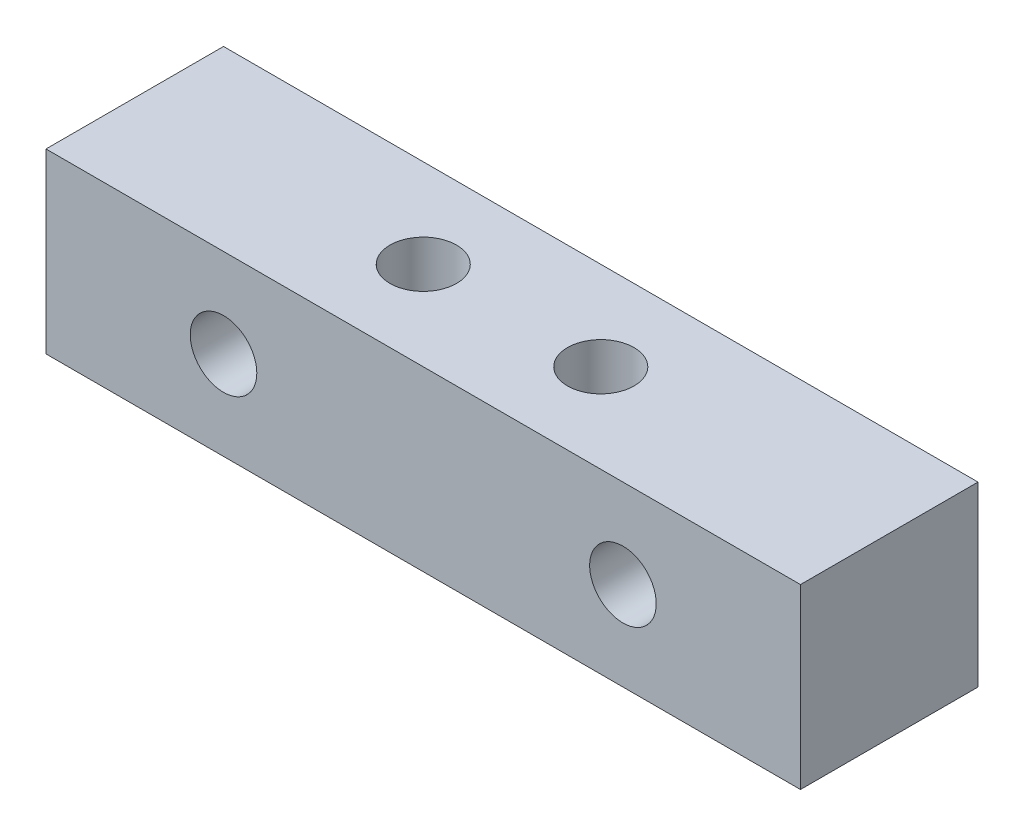
ISO-10303-21;
HEADER;
FILE_DESCRIPTION(('STEP AP214'),'2;1');
FILE_NAME('part.step','',(''),(''),'','','');
FILE_SCHEMA(('AUTOMOTIVE_DESIGN { 1 0 10303 214 1 1 1 1 }'));
ENDSEC;
DATA;
#1=APPLICATION_CONTEXT('core data for automotive mechanical design processes');
#2=APPLICATION_PROTOCOL_DEFINITION('international standard','automotive_design',2000,#1);
#3=PRODUCT_CONTEXT('',#1,'mechanical');
#4=PRODUCT('Part','Part','',(#3));
#5=PRODUCT_RELATED_PRODUCT_CATEGORY('part','',(#4));
#6=PRODUCT_DEFINITION_FORMATION('','',#4);
#7=PRODUCT_DEFINITION_CONTEXT('part definition',#1,'design');
#8=PRODUCT_DEFINITION('design','',#6,#7);
#9=PRODUCT_DEFINITION_SHAPE('','',#8);
#10=(LENGTH_UNIT() NAMED_UNIT(*) SI_UNIT(.MILLI.,.METRE.));
#11=(NAMED_UNIT(*) PLANE_ANGLE_UNIT() SI_UNIT($,.RADIAN.));
#12=(NAMED_UNIT(*) SI_UNIT($,.STERADIAN.) SOLID_ANGLE_UNIT());
#13=UNCERTAINTY_MEASURE_WITH_UNIT(LENGTH_MEASURE(1.E-05),#10,'distance_accuracy_value','');
#14=(GEOMETRIC_REPRESENTATION_CONTEXT(3) GLOBAL_UNCERTAINTY_ASSIGNED_CONTEXT((#13)) GLOBAL_UNIT_ASSIGNED_CONTEXT((#10,
#11,#12)) REPRESENTATION_CONTEXT('',''));
#15=CARTESIAN_POINT('',(0.,0.,0.));
#16=DIRECTION('',(0.,0.,1.));
#17=DIRECTION('',(1.,0.,0.));
#18=AXIS2_PLACEMENT_3D('',#15,#16,#17);
#19=CARTESIAN_POINT('',(0.,0.,8.));
#20=DIRECTION('',(1.,0.,0.));
#21=DIRECTION('',(0.,0.,-1.));
#22=AXIS2_PLACEMENT_3D('',#19,#20,#21);
#23=PLANE('',#22);
#24=DIRECTION('',(0.,-1.,0.));
#25=VECTOR('',#24,1.);
#26=CARTESIAN_POINT('',(0.,0.,0.));
#27=LINE('',#26,#25);
#28=CARTESIAN_POINT('',(0.,8.,0.));
#29=VERTEX_POINT('',#28);
#30=CARTESIAN_POINT('',(0.,0.,0.));
#31=VERTEX_POINT('',#30);
#32=EDGE_CURVE('E98',#29,#31,#27,.T.);
#33=ORIENTED_EDGE('',*,*,#32,.T.);
#34=DIRECTION('',(0.,0.,-1.));
#35=VECTOR('',#34,1.);
#36=CARTESIAN_POINT('',(0.,0.,8.));
#37=LINE('',#36,#35);
#38=CARTESIAN_POINT('',(0.,0.,8.));
#39=VERTEX_POINT('',#38);
#40=EDGE_CURVE('E11',#39,#31,#37,.T.);
#41=ORIENTED_EDGE('',*,*,#40,.F.);
#42=DIRECTION('',(0.,-1.,0.));
#43=VECTOR('',#42,1.);
#44=CARTESIAN_POINT('',(0.,0.,8.));
#45=LINE('',#44,#43);
#46=CARTESIAN_POINT('',(0.,8.,8.));
#47=VERTEX_POINT('',#46);
#48=EDGE_CURVE('E86',#47,#39,#45,.T.);
#49=ORIENTED_EDGE('',*,*,#48,.F.);
#50=DIRECTION('',(0.,0.,-1.));
#51=VECTOR('',#50,1.);
#52=CARTESIAN_POINT('',(0.,8.,8.));
#53=LINE('',#52,#51);
#54=EDGE_CURVE('E94',#47,#29,#53,.T.);
#55=ORIENTED_EDGE('',*,*,#54,.T.);
#56=EDGE_LOOP('',(#33,#41,#49,#55));
#57=FACE_BOUND('',#56,.T.);
#58=ADVANCED_FACE('F35',(#57),#23,.F.);
#59=CARTESIAN_POINT('',(0.,0.,8.));
#60=DIRECTION('',(0.,1.,0.));
#61=DIRECTION('',(0.,0.,1.));
#62=AXIS2_PLACEMENT_3D('',#59,#60,#61);
#63=PLANE('',#62);
#64=CARTESIAN_POINT('',(13.,0.,4.));
#65=DIRECTION('',(0.,1.,0.));
#66=DIRECTION('',(0.,0.,1.));
#67=AXIS2_PLACEMENT_3D('',#64,#65,#66);
#68=CIRCLE('',#67,1.5);
#69=CARTESIAN_POINT('',(13.,0.,5.5));
#70=VERTEX_POINT('',#69);
#71=EDGE_CURVE('E116',#70,#70,#68,.T.);
#72=ORIENTED_EDGE('',*,*,#71,.T.);
#73=EDGE_LOOP('',(#72));
#74=FACE_BOUND('',#73,.T.);
#75=CARTESIAN_POINT('',(21.,0.,4.));
#76=DIRECTION('',(0.,1.,0.));
#77=DIRECTION('',(0.,0.,1.));
#78=AXIS2_PLACEMENT_3D('',#75,#76,#77);
#79=CIRCLE('',#78,1.5);
#80=CARTESIAN_POINT('',(21.,0.,5.5));
#81=VERTEX_POINT('',#80);
#82=EDGE_CURVE('E127',#81,#81,#79,.T.);
#83=ORIENTED_EDGE('',*,*,#82,.T.);
#84=EDGE_LOOP('',(#83));
#85=FACE_BOUND('',#84,.T.);
#86=DIRECTION('',(1.,0.,0.));
#87=VECTOR('',#86,1.);
#88=CARTESIAN_POINT('',(0.,0.,0.));
#89=LINE('',#88,#87);
#90=CARTESIAN_POINT('',(34.,0.,0.));
#91=VERTEX_POINT('',#90);
#92=EDGE_CURVE('E90',#31,#91,#89,.T.);
#93=ORIENTED_EDGE('',*,*,#92,.T.);
#94=DIRECTION('',(0.,0.,-1.));
#95=VECTOR('',#94,1.);
#96=CARTESIAN_POINT('',(34.,0.,8.));
#97=LINE('',#96,#95);
#98=CARTESIAN_POINT('',(34.,0.,8.));
#99=VERTEX_POINT('',#98);
#100=EDGE_CURVE('E43',#99,#91,#97,.T.);
#101=ORIENTED_EDGE('',*,*,#100,.F.);
#102=DIRECTION('',(1.,0.,0.));
#103=VECTOR('',#102,1.);
#104=CARTESIAN_POINT('',(0.,0.,8.));
#105=LINE('',#104,#103);
#106=EDGE_CURVE('E81',#39,#99,#105,.T.);
#107=ORIENTED_EDGE('',*,*,#106,.F.);
#108=ORIENTED_EDGE('',*,*,#40,.T.);
#109=EDGE_LOOP('',(#93,#101,#107,#108));
#110=FACE_BOUND('',#109,.T.);
#111=ADVANCED_FACE('F89',(#74,#85,#110),#63,.F.);
#112=CARTESIAN_POINT('',(34.,0.,8.));
#113=DIRECTION('',(-1.,0.,0.));
#114=DIRECTION('',(0.,0.,1.));
#115=AXIS2_PLACEMENT_3D('',#112,#113,#114);
#116=PLANE('',#115);
#117=DIRECTION('',(0.,1.,0.));
#118=VECTOR('',#117,1.);
#119=CARTESIAN_POINT('',(34.,0.,0.));
#120=LINE('',#119,#118);
#121=CARTESIAN_POINT('',(34.,8.,0.));
#122=VERTEX_POINT('',#121);
#123=EDGE_CURVE('E68',#91,#122,#120,.T.);
#124=ORIENTED_EDGE('',*,*,#123,.T.);
#125=DIRECTION('',(0.,0.,-1.));
#126=VECTOR('',#125,1.);
#127=CARTESIAN_POINT('',(34.,8.,8.));
#128=LINE('',#127,#126);
#129=CARTESIAN_POINT('',(34.,8.,8.));
#130=VERTEX_POINT('',#129);
#131=EDGE_CURVE('E91',#130,#122,#128,.T.);
#132=ORIENTED_EDGE('',*,*,#131,.F.);
#133=DIRECTION('',(0.,1.,0.));
#134=VECTOR('',#133,1.);
#135=CARTESIAN_POINT('',(34.,0.,8.));
#136=LINE('',#135,#134);
#137=EDGE_CURVE('E84',#99,#130,#136,.T.);
#138=ORIENTED_EDGE('',*,*,#137,.F.);
#139=ORIENTED_EDGE('',*,*,#100,.T.);
#140=EDGE_LOOP('',(#124,#132,#138,#139));
#141=FACE_BOUND('',#140,.T.);
#142=ADVANCED_FACE('F92',(#141),#116,.F.);
#143=CARTESIAN_POINT('',(0.,8.,8.));
#144=DIRECTION('',(0.,-1.,0.));
#145=DIRECTION('',(0.,0.,-1.));
#146=AXIS2_PLACEMENT_3D('',#143,#144,#145);
#147=PLANE('',#146);
#148=CARTESIAN_POINT('',(13.,8.,4.));
#149=DIRECTION('',(0.,1.,0.));
#150=DIRECTION('',(0.,0.,1.));
#151=AXIS2_PLACEMENT_3D('',#148,#149,#150);
#152=CIRCLE('',#151,1.5);
#153=CARTESIAN_POINT('',(13.,8.,5.5));
#154=VERTEX_POINT('',#153);
#155=EDGE_CURVE('E130',#154,#154,#152,.T.);
#156=ORIENTED_EDGE('',*,*,#155,.F.);
#157=EDGE_LOOP('',(#156));
#158=FACE_BOUND('',#157,.T.);
#159=CARTESIAN_POINT('',(21.,8.,4.));
#160=DIRECTION('',(0.,1.,0.));
#161=DIRECTION('',(0.,0.,1.));
#162=AXIS2_PLACEMENT_3D('',#159,#160,#161);
#163=CIRCLE('',#162,1.5);
#164=CARTESIAN_POINT('',(21.,8.,5.5));
#165=VERTEX_POINT('',#164);
#166=EDGE_CURVE('E124',#165,#165,#163,.T.);
#167=ORIENTED_EDGE('',*,*,#166,.F.);
#168=EDGE_LOOP('',(#167));
#169=FACE_BOUND('',#168,.T.);
#170=DIRECTION('',(-1.,0.,0.));
#171=VECTOR('',#170,1.);
#172=CARTESIAN_POINT('',(0.,8.,0.));
#173=LINE('',#172,#171);
#174=EDGE_CURVE('E74',#122,#29,#173,.T.);
#175=ORIENTED_EDGE('',*,*,#174,.T.);
#176=ORIENTED_EDGE('',*,*,#54,.F.);
#177=DIRECTION('',(-1.,0.,0.));
#178=VECTOR('',#177,1.);
#179=CARTESIAN_POINT('',(0.,8.,8.));
#180=LINE('',#179,#178);
#181=EDGE_CURVE('E51',#130,#47,#180,.T.);
#182=ORIENTED_EDGE('',*,*,#181,.F.);
#183=ORIENTED_EDGE('',*,*,#131,.T.);
#184=EDGE_LOOP('',(#175,#176,#182,#183));
#185=FACE_BOUND('',#184,.T.);
#186=ADVANCED_FACE('F106',(#158,#169,#185),#147,.F.);
#187=CARTESIAN_POINT('',(0.,0.,8.));
#188=DIRECTION('',(0.,0.,-1.));
#189=DIRECTION('',(-1.,0.,0.));
#190=AXIS2_PLACEMENT_3D('',#187,#188,#189);
#191=PLANE('',#190);
#192=CARTESIAN_POINT('',(8.,4.,8.));
#193=DIRECTION('',(0.,0.,1.));
#194=DIRECTION('',(1.,0.,0.));
#195=AXIS2_PLACEMENT_3D('',#192,#193,#194);
#196=CIRCLE('',#195,1.5);
#197=CARTESIAN_POINT('',(9.5,4.,8.));
#198=VERTEX_POINT('',#197);
#199=EDGE_CURVE('E119',#198,#198,#196,.T.);
#200=ORIENTED_EDGE('',*,*,#199,.F.);
#201=EDGE_LOOP('',(#200));
#202=FACE_BOUND('',#201,.T.);
#203=CARTESIAN_POINT('',(26.,4.,8.));
#204=DIRECTION('',(0.,0.,1.));
#205=DIRECTION('',(1.,0.,0.));
#206=AXIS2_PLACEMENT_3D('',#203,#204,#205);
#207=CIRCLE('',#206,1.5);
#208=CARTESIAN_POINT('',(27.5,4.,8.));
#209=VERTEX_POINT('',#208);
#210=EDGE_CURVE('E112',#209,#209,#207,.T.);
#211=ORIENTED_EDGE('',*,*,#210,.F.);
#212=EDGE_LOOP('',(#211));
#213=FACE_BOUND('',#212,.T.);
#214=ORIENTED_EDGE('',*,*,#48,.T.);
#215=ORIENTED_EDGE('',*,*,#106,.T.);
#216=ORIENTED_EDGE('',*,*,#137,.T.);
#217=ORIENTED_EDGE('',*,*,#181,.T.);
#218=EDGE_LOOP('',(#214,#215,#216,#217));
#219=FACE_BOUND('',#218,.T.);
#220=ADVANCED_FACE('F82',(#202,#213,#219),#191,.F.);
#221=CARTESIAN_POINT('',(0.,0.,0.));
#222=DIRECTION('',(0.,0.,-1.));
#223=DIRECTION('',(-1.,0.,0.));
#224=AXIS2_PLACEMENT_3D('',#221,#222,#223);
#225=PLANE('',#224);
#226=CARTESIAN_POINT('',(8.,4.,0.));
#227=DIRECTION('',(0.,0.,1.));
#228=DIRECTION('',(1.,0.,0.));
#229=AXIS2_PLACEMENT_3D('',#226,#227,#228);
#230=CIRCLE('',#229,1.5);
#231=CARTESIAN_POINT('',(9.5,4.,0.));
#232=VERTEX_POINT('',#231);
#233=EDGE_CURVE('E101',#232,#232,#230,.T.);
#234=ORIENTED_EDGE('',*,*,#233,.T.);
#235=EDGE_LOOP('',(#234));
#236=FACE_BOUND('',#235,.T.);
#237=CARTESIAN_POINT('',(26.,4.,0.));
#238=DIRECTION('',(0.,0.,1.));
#239=DIRECTION('',(1.,0.,0.));
#240=AXIS2_PLACEMENT_3D('',#237,#238,#239);
#241=CIRCLE('',#240,1.5);
#242=CARTESIAN_POINT('',(27.5,4.,0.));
#243=VERTEX_POINT('',#242);
#244=EDGE_CURVE('E115',#243,#243,#241,.T.);
#245=ORIENTED_EDGE('',*,*,#244,.T.);
#246=EDGE_LOOP('',(#245));
#247=FACE_BOUND('',#246,.T.);
#248=ORIENTED_EDGE('',*,*,#32,.F.);
#249=ORIENTED_EDGE('',*,*,#174,.F.);
#250=ORIENTED_EDGE('',*,*,#123,.F.);
#251=ORIENTED_EDGE('',*,*,#92,.F.);
#252=EDGE_LOOP('',(#248,#249,#250,#251));
#253=FACE_BOUND('',#252,.T.);
#254=ADVANCED_FACE('F109',(#236,#247,#253),#225,.T.);
#255=CARTESIAN_POINT('',(26.,4.,0.));
#256=DIRECTION('',(0.,0.,1.));
#257=DIRECTION('',(1.,0.,0.));
#258=AXIS2_PLACEMENT_3D('',#255,#256,#257);
#259=CYLINDRICAL_SURFACE('',#258,1.5);
#260=ORIENTED_EDGE('',*,*,#244,.F.);
#261=EDGE_LOOP('',(#260));
#262=FACE_BOUND('',#261,.T.);
#263=ORIENTED_EDGE('',*,*,#210,.T.);
#264=EDGE_LOOP('',(#263));
#265=FACE_BOUND('',#264,.T.);
#266=ADVANCED_FACE('F157',(#262,#265),#259,.F.);
#267=CARTESIAN_POINT('',(8.,4.,0.));
#268=DIRECTION('',(0.,0.,1.));
#269=DIRECTION('',(1.,0.,0.));
#270=AXIS2_PLACEMENT_3D('',#267,#268,#269);
#271=CYLINDRICAL_SURFACE('',#270,1.5);
#272=ORIENTED_EDGE('',*,*,#233,.F.);
#273=EDGE_LOOP('',(#272));
#274=FACE_BOUND('',#273,.T.);
#275=ORIENTED_EDGE('',*,*,#199,.T.);
#276=EDGE_LOOP('',(#275));
#277=FACE_BOUND('',#276,.T.);
#278=ADVANCED_FACE('F151',(#274,#277),#271,.F.);
#279=CARTESIAN_POINT('',(21.,0.,4.));
#280=DIRECTION('',(0.,1.,0.));
#281=DIRECTION('',(0.,0.,1.));
#282=AXIS2_PLACEMENT_3D('',#279,#280,#281);
#283=CYLINDRICAL_SURFACE('',#282,1.5);
#284=ORIENTED_EDGE('',*,*,#82,.F.);
#285=EDGE_LOOP('',(#284));
#286=FACE_BOUND('',#285,.T.);
#287=ORIENTED_EDGE('',*,*,#166,.T.);
#288=EDGE_LOOP('',(#287));
#289=FACE_BOUND('',#288,.T.);
#290=ADVANCED_FACE('F141',(#286,#289),#283,.F.);
#291=CARTESIAN_POINT('',(13.,0.,4.));
#292=DIRECTION('',(0.,1.,0.));
#293=DIRECTION('',(0.,0.,1.));
#294=AXIS2_PLACEMENT_3D('',#291,#292,#293);
#295=CYLINDRICAL_SURFACE('',#294,1.5);
#296=ORIENTED_EDGE('',*,*,#71,.F.);
#297=EDGE_LOOP('',(#296));
#298=FACE_BOUND('',#297,.T.);
#299=ORIENTED_EDGE('',*,*,#155,.T.);
#300=EDGE_LOOP('',(#299));
#301=FACE_BOUND('',#300,.T.);
#302=ADVANCED_FACE('F138',(#298,#301),#295,.F.);
#303=CLOSED_SHELL('',(#58,#111,#142,#186,#220,#254,#266,#278,#290,#302));
#304=MANIFOLD_SOLID_BREP('B2',#303);
#305=ADVANCED_BREP_SHAPE_REPRESENTATION('',(#18,#304),#14);
#306=SHAPE_DEFINITION_REPRESENTATION(#9,#305);
ENDSEC;
END-ISO-10303-21;
